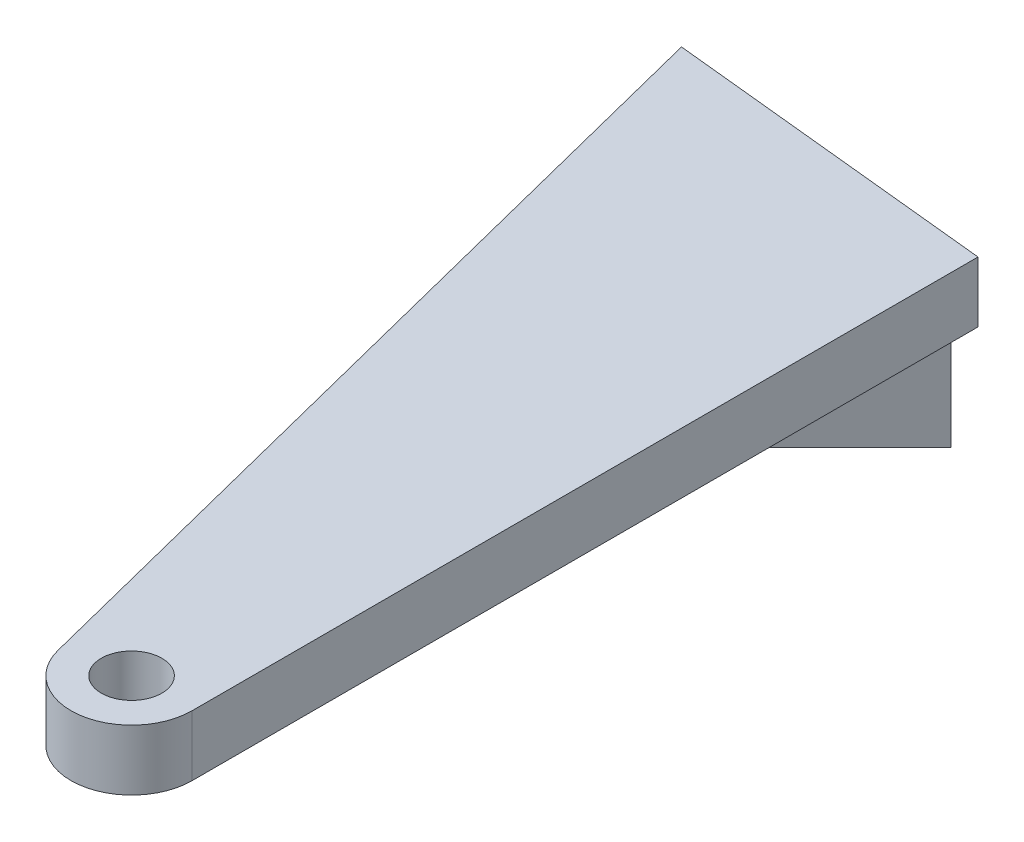
ISO-10303-21;
HEADER;
FILE_DESCRIPTION(('STEP AP214'),'2;1');
FILE_NAME('part.step','',(''),(''),'','','');
FILE_SCHEMA(('AUTOMOTIVE_DESIGN { 1 0 10303 214 1 1 1 1 }'));
ENDSEC;
DATA;
#1=APPLICATION_CONTEXT('core data for automotive mechanical design processes');
#2=APPLICATION_PROTOCOL_DEFINITION('international standard','automotive_design',2000,#1);
#3=PRODUCT_CONTEXT('',#1,'mechanical');
#4=PRODUCT('Part','Part','',(#3));
#5=PRODUCT_RELATED_PRODUCT_CATEGORY('part','',(#4));
#6=PRODUCT_DEFINITION_FORMATION('','',#4);
#7=PRODUCT_DEFINITION_CONTEXT('part definition',#1,'design');
#8=PRODUCT_DEFINITION('design','',#6,#7);
#9=PRODUCT_DEFINITION_SHAPE('','',#8);
#10=(LENGTH_UNIT() NAMED_UNIT(*) SI_UNIT(.MILLI.,.METRE.));
#11=(NAMED_UNIT(*) PLANE_ANGLE_UNIT() SI_UNIT($,.RADIAN.));
#12=(NAMED_UNIT(*) SI_UNIT($,.STERADIAN.) SOLID_ANGLE_UNIT());
#13=UNCERTAINTY_MEASURE_WITH_UNIT(LENGTH_MEASURE(1.E-05),#10,'distance_accuracy_value','');
#14=(GEOMETRIC_REPRESENTATION_CONTEXT(3) GLOBAL_UNCERTAINTY_ASSIGNED_CONTEXT((#13)) GLOBAL_UNIT_ASSIGNED_CONTEXT((#10,
#11,#12)) REPRESENTATION_CONTEXT('',''));
#15=CARTESIAN_POINT('',(0.,0.,0.));
#16=DIRECTION('',(0.,0.,1.));
#17=DIRECTION('',(1.,0.,0.));
#18=AXIS2_PLACEMENT_3D('',#15,#16,#17);
#19=CARTESIAN_POINT('',(-6.0868177174483,0.,59.7211003442948));
#20=DIRECTION('',(-0.101395443961844,0.,0.9948462011506));
#21=DIRECTION('',(0.9948462011506,0.,0.101395443961844));
#22=AXIS2_PLACEMENT_3D('',#19,#20,#21);
#23=PLANE('',#22);
#24=DIRECTION('',(0.9948462011506,0.,0.101395443961844));
#25=VECTOR('',#24,1.);
#26=CARTESIAN_POINT('',(-562.904605816513,144.5,2.96982887654567));
#27=LINE('',#26,#25);
#28=CARTESIAN_POINT('',(-574.046912851957,144.5,1.8341968890974));
#29=VERTEX_POINT('',#28);
#30=CARTESIAN_POINT('',(-563.149519052838,144.5,2.94486714245992));
#31=VERTEX_POINT('',#30);
#32=EDGE_CURVE('E146',#29,#31,#27,.T.);
#33=ORIENTED_EDGE('',*,*,#32,.T.);
#34=DIRECTION('',(0.,1.,0.));
#35=VECTOR('',#34,1.);
#36=CARTESIAN_POINT('',(-563.149519052838,142.5,2.94486714245992));
#37=LINE('',#36,#35);
#38=CARTESIAN_POINT('',(-563.149519052838,142.5,2.94486714245992));
#39=VERTEX_POINT('',#38);
#40=EDGE_CURVE('E175',#39,#31,#37,.T.);
#41=ORIENTED_EDGE('',*,*,#40,.F.);
#42=DIRECTION('',(-0.9948462011506,0.,-0.101395443961845));
#43=VECTOR('',#42,1.);
#44=CARTESIAN_POINT('',(-562.904605816513,142.5,2.96982887654568));
#45=LINE('',#44,#43);
#46=CARTESIAN_POINT('',(-564.149519052838,142.5,2.84294641959384));
#47=VERTEX_POINT('',#46);
#48=EDGE_CURVE('E148',#39,#47,#45,.T.);
#49=ORIENTED_EDGE('',*,*,#48,.T.);
#50=DIRECTION('',(0.,1.,0.));
#51=VECTOR('',#50,1.);
#52=CARTESIAN_POINT('',(-564.149519052838,138.5,2.84294641959384));
#53=LINE('',#52,#51);
#54=CARTESIAN_POINT('',(-564.149519052838,138.5,2.84294641959384));
#55=VERTEX_POINT('',#54);
#56=EDGE_CURVE('E127',#55,#47,#53,.T.);
#57=ORIENTED_EDGE('',*,*,#56,.F.);
#58=DIRECTION('',(0.9948462011506,0.,0.101395443961845));
#59=VECTOR('',#58,1.);
#60=CARTESIAN_POINT('',(-564.149519052838,138.5,2.84294641959384));
#61=LINE('',#60,#59);
#62=CARTESIAN_POINT('',(-572.046912851957,138.5,2.03803833482957));
#63=VERTEX_POINT('',#62);
#64=EDGE_CURVE('E110',#63,#55,#61,.T.);
#65=ORIENTED_EDGE('',*,*,#64,.F.);
#66=DIRECTION('',(0.,1.,0.));
#67=VECTOR('',#66,1.);
#68=CARTESIAN_POINT('',(-572.046912851957,138.5,2.03803833482956));
#69=LINE('',#68,#67);
#70=CARTESIAN_POINT('',(-572.046912851957,142.5,2.03803833482956));
#71=VERTEX_POINT('',#70);
#72=EDGE_CURVE('E11',#63,#71,#69,.T.);
#73=ORIENTED_EDGE('',*,*,#72,.T.);
#74=CARTESIAN_POINT('',(-574.046912851957,142.5,1.8341968890974));
#75=VERTEX_POINT('',#74);
#76=EDGE_CURVE('E154',#71,#75,#45,.T.);
#77=ORIENTED_EDGE('',*,*,#76,.T.);
#78=DIRECTION('',(0.,1.,0.));
#79=VECTOR('',#78,1.);
#80=CARTESIAN_POINT('',(-574.046912851957,142.5,1.8341968890974));
#81=LINE('',#80,#79);
#82=EDGE_CURVE('E54',#75,#29,#81,.T.);
#83=ORIENTED_EDGE('',*,*,#82,.T.);
#84=EDGE_LOOP('',(#33,#41,#49,#57,#65,#73,#77,#83));
#85=FACE_BOUND('',#84,.T.);
#86=ADVANCED_FACE('F45',(#85),#23,.F.);
#87=CARTESIAN_POINT('',(-565.149519052838,142.5,28.8827915153688));
#88=DIRECTION('',(0.,1.,0.));
#89=DIRECTION('',(0.,0.,1.));
#90=AXIS2_PLACEMENT_3D('',#87,#88,#89);
#91=CYLINDRICAL_SURFACE('',#90,1.00000000000005);
#92=CARTESIAN_POINT('',(-565.149519052838,142.5,28.8827915153688));
#93=DIRECTION('',(0.,1.,0.));
#94=DIRECTION('',(0.,0.,1.));
#95=AXIS2_PLACEMENT_3D('',#92,#93,#94);
#96=CIRCLE('',#95,1.00000000000005);
#97=CARTESIAN_POINT('',(-565.149519052838,142.5,29.8827915153688));
#98=VERTEX_POINT('',#97);
#99=EDGE_CURVE('E157',#98,#98,#96,.T.);
#100=ORIENTED_EDGE('',*,*,#99,.F.);
#101=EDGE_LOOP('',(#100));
#102=FACE_BOUND('',#101,.T.);
#103=CARTESIAN_POINT('',(-565.149519052838,144.5,28.8827915153688));
#104=DIRECTION('',(0.,1.,0.));
#105=DIRECTION('',(0.,0.,1.));
#106=AXIS2_PLACEMENT_3D('',#103,#104,#105);
#107=CIRCLE('',#106,1.00000000000005);
#108=CARTESIAN_POINT('',(-565.149519052838,144.5,29.8827915153688));
#109=VERTEX_POINT('',#108);
#110=EDGE_CURVE('E149',#109,#109,#107,.T.);
#111=ORIENTED_EDGE('',*,*,#110,.T.);
#112=EDGE_LOOP('',(#111));
#113=FACE_BOUND('',#112,.T.);
#114=ADVANCED_FACE('F222',(#102,#113),#91,.F.);
#115=CARTESIAN_POINT('',(-569.822122072519,138.5,10.8429464195938));
#116=DIRECTION('',(0.969528918314512,0.,-0.24497688983227));
#117=DIRECTION('',(-0.24497688983227,0.,-0.969528918314512));
#118=AXIS2_PLACEMENT_3D('',#115,#116,#117);
#119=PLANE('',#118);
#120=DIRECTION('',(-0.224193880826777,-0.403083081607189,-0.887277371018714));
#121=VECTOR('',#120,1.);
#122=CARTESIAN_POINT('',(-572.046912851957,138.5,2.03803833482957));
#123=LINE('',#122,#121);
#124=CARTESIAN_POINT('',(-569.822122072519,142.5,10.8429464195939));
#125=VERTEX_POINT('',#124);
#126=EDGE_CURVE('E115',#125,#63,#123,.T.);
#127=ORIENTED_EDGE('',*,*,#126,.F.);
#128=DIRECTION('',(-0.24497688983227,0.,-0.969528918314512));
#129=VECTOR('',#128,1.);
#130=CARTESIAN_POINT('',(-569.822122072519,142.5,10.8429464195938));
#131=LINE('',#130,#129);
#132=EDGE_CURVE('E123',#125,#71,#131,.T.);
#133=ORIENTED_EDGE('',*,*,#132,.T.);
#134=ORIENTED_EDGE('',*,*,#72,.F.);
#135=EDGE_LOOP('',(#127,#133,#134));
#136=FACE_BOUND('',#135,.T.);
#137=ADVANCED_FACE('F220',(#136),#119,.F.);
#138=CARTESIAN_POINT('',(-565.149519052838,142.5,28.8827915153688));
#139=DIRECTION('',(0.,1.,0.));
#140=DIRECTION('',(0.,0.,1.));
#141=AXIS2_PLACEMENT_3D('',#138,#139,#140);
#142=PLANE('',#141);
#143=ORIENTED_EDGE('',*,*,#99,.T.);
#144=EDGE_LOOP('',(#143));
#145=FACE_BOUND('',#144,.T.);
#146=ORIENTED_EDGE('',*,*,#132,.F.);
#147=DIRECTION('',(-1.,0.,0.));
#148=VECTOR('',#147,1.);
#149=CARTESIAN_POINT('',(-569.822122072519,142.5,10.8429464195938));
#150=LINE('',#149,#148);
#151=CARTESIAN_POINT('',(-564.149519052838,142.5,10.8429464195938));
#152=VERTEX_POINT('',#151);
#153=EDGE_CURVE('E107',#152,#125,#150,.T.);
#154=ORIENTED_EDGE('',*,*,#153,.F.);
#155=DIRECTION('',(0.,0.,1.));
#156=VECTOR('',#155,1.);
#157=CARTESIAN_POINT('',(-564.149519052838,142.5,10.8429464195938));
#158=LINE('',#157,#156);
#159=EDGE_CURVE('E121',#47,#152,#158,.T.);
#160=ORIENTED_EDGE('',*,*,#159,.F.);
#161=ORIENTED_EDGE('',*,*,#48,.F.);
#162=DIRECTION('',(0.,0.,-1.));
#163=VECTOR('',#162,1.);
#164=CARTESIAN_POINT('',(-563.149519052838,142.5,-0.999980256818761));
#165=LINE('',#164,#163);
#166=CARTESIAN_POINT('',(-563.149519052838,142.5,28.8827915153688));
#167=VERTEX_POINT('',#166);
#168=EDGE_CURVE('E176',#167,#39,#165,.T.);
#169=ORIENTED_EDGE('',*,*,#168,.F.);
#170=CARTESIAN_POINT('',(-565.149519052838,142.5,28.8827915153688));
#171=DIRECTION('',(0.,1.,0.));
#172=DIRECTION('',(0.,0.,1.));
#173=AXIS2_PLACEMENT_3D('',#170,#171,#172);
#174=CIRCLE('',#173,1.99999999999991);
#175=CARTESIAN_POINT('',(-567.088576889467,142.5,29.3727452950333));
#176=VERTEX_POINT('',#175);
#177=EDGE_CURVE('E171',#176,#167,#174,.T.);
#178=ORIENTED_EDGE('',*,*,#177,.F.);
#179=DIRECTION('',(0.244976889832272,0.,0.969528918314512));
#180=VECTOR('',#179,1.);
#181=CARTESIAN_POINT('',(-574.027091748517,142.5,1.91264156602698));
#182=LINE('',#181,#180);
#183=EDGE_CURVE('E166',#75,#176,#182,.T.);
#184=ORIENTED_EDGE('',*,*,#183,.F.);
#185=ORIENTED_EDGE('',*,*,#76,.F.);
#186=EDGE_LOOP('',(#146,#154,#160,#161,#169,#178,#184,#185));
#187=FACE_BOUND('',#186,.T.);
#188=ADVANCED_FACE('F120',(#145,#187),#142,.F.);
#189=CARTESIAN_POINT('',(-564.149519052838,138.5,10.8429464195938));
#190=DIRECTION('',(-1.,0.,0.));
#191=DIRECTION('',(0.,0.,1.));
#192=AXIS2_PLACEMENT_3D('',#189,#190,#191);
#193=PLANE('',#192);
#194=DIRECTION('',(0.,0.447213595499956,0.894427190999917));
#195=VECTOR('',#194,1.);
#196=CARTESIAN_POINT('',(-564.149519052838,138.5,2.84294641959384));
#197=LINE('',#196,#195);
#198=EDGE_CURVE('E103',#55,#152,#197,.T.);
#199=ORIENTED_EDGE('',*,*,#198,.F.);
#200=ORIENTED_EDGE('',*,*,#56,.T.);
#201=ORIENTED_EDGE('',*,*,#159,.T.);
#202=EDGE_LOOP('',(#199,#200,#201));
#203=FACE_BOUND('',#202,.T.);
#204=ADVANCED_FACE('F126',(#203),#193,.F.);
#205=CARTESIAN_POINT('',(-564.149519052838,142.5,10.8429464195938));
#206=CARTESIAN_POINT('',(-566.040386726065,142.5,10.8429464195938));
#207=CARTESIAN_POINT('',(-567.931254399292,142.5,10.8429464195938));
#208=CARTESIAN_POINT('',(-569.822122072519,142.5,10.8429464195939));
#209=CARTESIAN_POINT('',(-564.149519052838,142.166666666667,10.1762797529272));
#210=CARTESIAN_POINT('',(-566.102186469938,142.166666666667,10.1539211950171));
#211=CARTESIAN_POINT('',(-568.054853887039,142.166666666667,10.1315626371069));
#212=CARTESIAN_POINT('',(-570.007521304139,142.166666666667,10.1092040791968));
#213=CARTESIAN_POINT('',(-564.149519052839,141.5,8.84294641959385));
#214=CARTESIAN_POINT('',(-566.225785957685,141.5,8.7758707458635));
#215=CARTESIAN_POINT('',(-568.302052862532,141.5,8.70879507213314));
#216=CARTESIAN_POINT('',(-570.378319767379,141.5,8.64171939840279));
#217=CARTESIAN_POINT('',(-564.149519052838,140.5,6.84294641959383));
#218=CARTESIAN_POINT('',(-566.411185189305,140.5,6.70879507213312));
#219=CARTESIAN_POINT('',(-568.672851325771,140.5,6.57464372467241));
#220=CARTESIAN_POINT('',(-570.934517462238,140.5,6.4404923772117));
#221=CARTESIAN_POINT('',(-564.149519052838,139.5,4.84294641959384));
#222=CARTESIAN_POINT('',(-566.596584420925,139.5,4.64171939840278));
#223=CARTESIAN_POINT('',(-569.043649789011,139.5,4.44049237721172));
#224=CARTESIAN_POINT('',(-571.490715157097,139.5,4.23926535602065));
#225=CARTESIAN_POINT('',(-564.149519052838,138.833333333333,3.50961308626051));
#226=CARTESIAN_POINT('',(-566.720183908671,138.833333333333,3.2636689492492));
#227=CARTESIAN_POINT('',(-569.290848764504,138.833333333333,3.0177248122379));
#228=CARTESIAN_POINT('',(-571.861513620337,138.833333333333,2.7717806752266));
#229=CARTESIAN_POINT('',(-564.149519052838,138.5,2.84294641959384));
#230=CARTESIAN_POINT('',(-566.781983652544,138.5,2.57464372467242));
#231=CARTESIAN_POINT('',(-569.414448252251,138.5,2.306341029751));
#232=CARTESIAN_POINT('',(-572.046912851957,138.5,2.03803833482957));
#233=B_SPLINE_SURFACE_WITH_KNOTS('',3,3,((#205,#206,#207,#208),(#209,#210,#211,#212),(#213,#214,
#215,#216),(#217,#218,#219,#220),(#221,#222,#223,#224),(#225,#226,#227,#228),(#229,#230,#231,
#232)),.UNSPECIFIED.,.F.,.F.,.F.,(4,1,1,1,4),(4,4),(0.570794249133681,0.678095686850261,
0.785397124566841,0.89269856228342,1.),(0.,1.),.UNSPECIFIED.);
#234=ORIENTED_EDGE('',*,*,#198,.T.);
#235=ORIENTED_EDGE('',*,*,#153,.T.);
#236=ORIENTED_EDGE('',*,*,#126,.T.);
#237=ORIENTED_EDGE('',*,*,#64,.T.);
#238=EDGE_LOOP('',(#234,#235,#236,#237));
#239=FACE_BOUND('',#238,.T.);
#240=ADVANCED_FACE('F105',(#239),#233,.F.);
#241=CARTESIAN_POINT('',(-565.149519052838,142.5,28.8827915153688));
#242=DIRECTION('',(0.,1.,0.));
#243=DIRECTION('',(0.,0.,1.));
#244=AXIS2_PLACEMENT_3D('',#241,#242,#243);
#245=CYLINDRICAL_SURFACE('',#244,1.99999999999991);
#246=CARTESIAN_POINT('',(-565.149519052838,144.5,28.8827915153688));
#247=DIRECTION('',(0.,1.,0.));
#248=DIRECTION('',(0.,0.,1.));
#249=AXIS2_PLACEMENT_3D('',#246,#247,#248);
#250=CIRCLE('',#249,1.99999999999991);
#251=CARTESIAN_POINT('',(-567.088576889467,144.5,29.3727452950333));
#252=VERTEX_POINT('',#251);
#253=CARTESIAN_POINT('',(-563.149519052838,144.5,28.8827915153688));
#254=VERTEX_POINT('',#253);
#255=EDGE_CURVE('E185',#252,#254,#250,.T.);
#256=ORIENTED_EDGE('',*,*,#255,.F.);
#257=DIRECTION('',(0.,1.,0.));
#258=VECTOR('',#257,1.);
#259=CARTESIAN_POINT('',(-567.088576889467,142.5,29.3727452950333));
#260=LINE('',#259,#258);
#261=EDGE_CURVE('E169',#176,#252,#260,.T.);
#262=ORIENTED_EDGE('',*,*,#261,.F.);
#263=ORIENTED_EDGE('',*,*,#177,.T.);
#264=DIRECTION('',(0.,1.,0.));
#265=VECTOR('',#264,1.);
#266=CARTESIAN_POINT('',(-563.149519052838,142.5,28.8827915153688));
#267=LINE('',#266,#265);
#268=EDGE_CURVE('E163',#167,#254,#267,.T.);
#269=ORIENTED_EDGE('',*,*,#268,.T.);
#270=EDGE_LOOP('',(#256,#262,#263,#269));
#271=FACE_BOUND('',#270,.T.);
#272=ADVANCED_FACE('F211',(#271),#245,.T.);
#273=CARTESIAN_POINT('',(-562.5,144.5,-0.999980256818761));
#274=DIRECTION('',(0.,1.,0.));
#275=DIRECTION('',(0.,0.,1.));
#276=AXIS2_PLACEMENT_3D('',#273,#274,#275);
#277=PLANE('',#276);
#278=ORIENTED_EDGE('',*,*,#32,.F.);
#279=DIRECTION('',(0.244976889832272,0.,0.969528918314512));
#280=VECTOR('',#279,1.);
#281=CARTESIAN_POINT('',(-574.027091748517,144.5,1.91264156602698));
#282=LINE('',#281,#280);
#283=EDGE_CURVE('E181',#29,#252,#282,.T.);
#284=ORIENTED_EDGE('',*,*,#283,.T.);
#285=ORIENTED_EDGE('',*,*,#255,.T.);
#286=DIRECTION('',(0.,0.,-1.));
#287=VECTOR('',#286,1.);
#288=CARTESIAN_POINT('',(-563.149519052838,144.5,-0.999980256818761));
#289=LINE('',#288,#287);
#290=EDGE_CURVE('E170',#254,#31,#289,.T.);
#291=ORIENTED_EDGE('',*,*,#290,.T.);
#292=EDGE_LOOP('',(#278,#284,#285,#291));
#293=FACE_BOUND('',#292,.T.);
#294=ORIENTED_EDGE('',*,*,#110,.F.);
#295=EDGE_LOOP('',(#294));
#296=FACE_BOUND('',#295,.T.);
#297=ADVANCED_FACE('F214',(#293,#296),#277,.T.);
#298=CARTESIAN_POINT('',(-563.149519052838,142.5,-0.999980256818761));
#299=DIRECTION('',(1.,0.,0.));
#300=DIRECTION('',(0.,0.,-1.));
#301=AXIS2_PLACEMENT_3D('',#298,#299,#300);
#302=PLANE('',#301);
#303=ORIENTED_EDGE('',*,*,#290,.F.);
#304=ORIENTED_EDGE('',*,*,#268,.F.);
#305=ORIENTED_EDGE('',*,*,#168,.T.);
#306=ORIENTED_EDGE('',*,*,#40,.T.);
#307=EDGE_LOOP('',(#303,#304,#305,#306));
#308=FACE_BOUND('',#307,.T.);
#309=ADVANCED_FACE('F217',(#308),#302,.T.);
#310=CARTESIAN_POINT('',(-574.027091748517,142.5,1.91264156602698));
#311=DIRECTION('',(-0.969528918314512,0.,0.244976889832272));
#312=DIRECTION('',(0.244976889832272,0.,0.969528918314512));
#313=AXIS2_PLACEMENT_3D('',#310,#311,#312);
#314=PLANE('',#313);
#315=ORIENTED_EDGE('',*,*,#283,.F.);
#316=ORIENTED_EDGE('',*,*,#82,.F.);
#317=ORIENTED_EDGE('',*,*,#183,.T.);
#318=ORIENTED_EDGE('',*,*,#261,.T.);
#319=EDGE_LOOP('',(#315,#316,#317,#318));
#320=FACE_BOUND('',#319,.T.);
#321=ADVANCED_FACE('F207',(#320),#314,.T.);
#322=CLOSED_SHELL('',(#86,#114,#137,#188,#204,#240,#272,#297,#309,#321));
#323=MANIFOLD_SOLID_BREP('B2',#322);
#324=ADVANCED_BREP_SHAPE_REPRESENTATION('',(#18,#323),#14);
#325=SHAPE_DEFINITION_REPRESENTATION(#9,#324);
ENDSEC;
END-ISO-10303-21;
